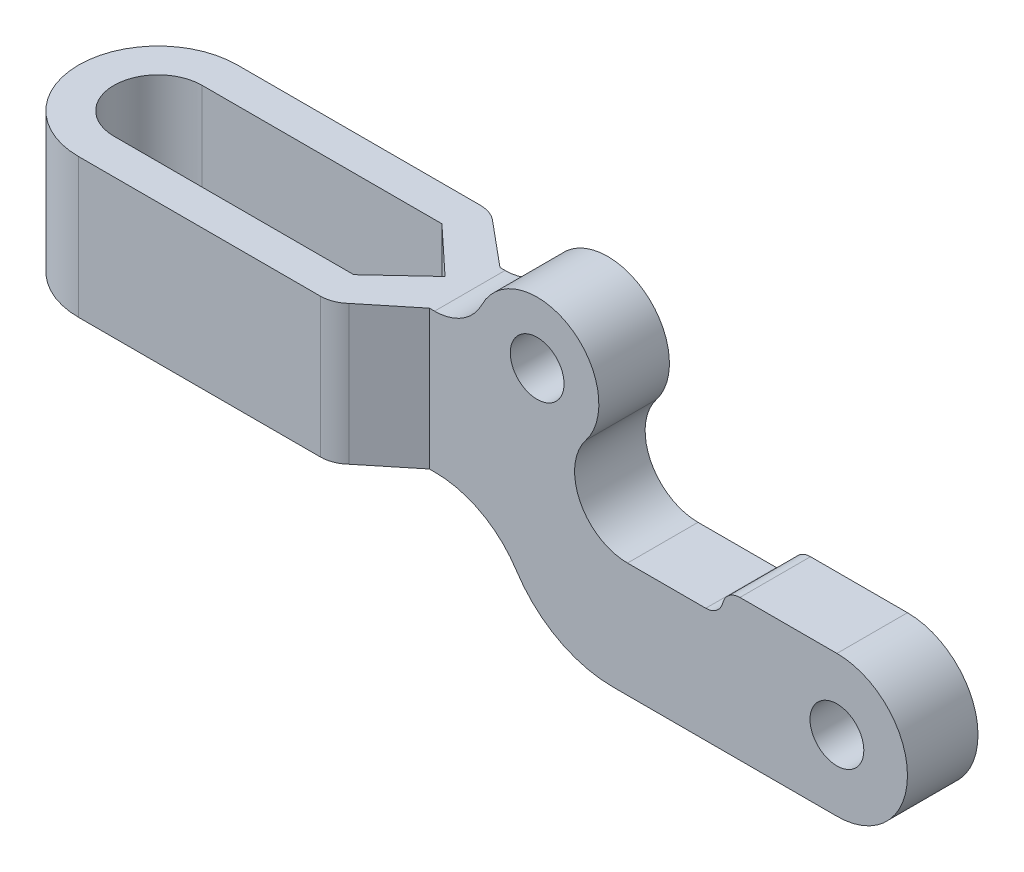
ISO-10303-21;
HEADER;
FILE_DESCRIPTION(('STEP AP214'),'2;1');
FILE_NAME('part.step','',(''),(''),'','','');
FILE_SCHEMA(('AUTOMOTIVE_DESIGN { 1 0 10303 214 1 1 1 1 }'));
ENDSEC;
DATA;
#1=APPLICATION_CONTEXT('core data for automotive mechanical design processes');
#2=APPLICATION_PROTOCOL_DEFINITION('international standard','automotive_design',2000,#1);
#3=PRODUCT_CONTEXT('',#1,'mechanical');
#4=PRODUCT('Part','Part','',(#3));
#5=PRODUCT_RELATED_PRODUCT_CATEGORY('part','',(#4));
#6=PRODUCT_DEFINITION_FORMATION('','',#4);
#7=PRODUCT_DEFINITION_CONTEXT('part definition',#1,'design');
#8=PRODUCT_DEFINITION('design','',#6,#7);
#9=PRODUCT_DEFINITION_SHAPE('','',#8);
#10=(LENGTH_UNIT() NAMED_UNIT(*) SI_UNIT(.MILLI.,.METRE.));
#11=(NAMED_UNIT(*) PLANE_ANGLE_UNIT() SI_UNIT($,.RADIAN.));
#12=(NAMED_UNIT(*) SI_UNIT($,.STERADIAN.) SOLID_ANGLE_UNIT());
#13=UNCERTAINTY_MEASURE_WITH_UNIT(LENGTH_MEASURE(1.E-05),#10,'distance_accuracy_value','');
#14=(GEOMETRIC_REPRESENTATION_CONTEXT(3) GLOBAL_UNCERTAINTY_ASSIGNED_CONTEXT((#13)) GLOBAL_UNIT_ASSIGNED_CONTEXT((#10,
#11,#12)) REPRESENTATION_CONTEXT('',''));
#15=CARTESIAN_POINT('',(0.,0.,0.));
#16=DIRECTION('',(0.,0.,1.));
#17=DIRECTION('',(1.,0.,0.));
#18=AXIS2_PLACEMENT_3D('',#15,#16,#17);
#19=CARTESIAN_POINT('',(-4.99794774322532,31.6999999999998,0.));
#20=DIRECTION('',(0.,0.,1.));
#21=DIRECTION('',(-1.,0.,0.));
#22=AXIS2_PLACEMENT_3D('',#19,#20,#21);
#23=PLANE('',#22);
#24=CARTESIAN_POINT('',(-25.9979474843078,25.1999999999998,0.));
#25=DIRECTION('',(0.,0.,-1.));
#26=DIRECTION('',(-1.,0.,0.));
#27=AXIS2_PLACEMENT_3D('',#24,#25,#26);
#28=CIRCLE('',#27,1.525);
#29=CARTESIAN_POINT('',(-27.5229474843078,25.1999999999998,0.));
#30=VERTEX_POINT('',#29);
#31=EDGE_CURVE('E245',#30,#30,#28,.F.);
#32=ORIENTED_EDGE('',*,*,#31,.T.);
#33=EDGE_LOOP('',(#32));
#34=FACE_BOUND('',#33,.T.);
#35=DIRECTION('',(0.,-1.,0.));
#36=VECTOR('',#35,1.);
#37=CARTESIAN_POINT('',(-32.1079477432253,31.6999999999998,0.));
#38=LINE('',#37,#36);
#39=CARTESIAN_POINT('',(-32.1079477432253,25.0999999999998,0.));
#40=VERTEX_POINT('',#39);
#41=CARTESIAN_POINT('',(-32.1079477432253,17.1999999999998,0.));
#42=VERTEX_POINT('',#41);
#43=EDGE_CURVE('E276',#40,#42,#38,.T.);
#44=ORIENTED_EDGE('',*,*,#43,.F.);
#45=DIRECTION('',(-1.,0.,0.));
#46=VECTOR('',#45,1.);
#47=CARTESIAN_POINT('',(-4.99794774322532,25.0999999999998,0.));
#48=LINE('',#47,#46);
#49=CARTESIAN_POINT('',(-31.8151633132071,25.0999999999998,0.));
#50=VERTEX_POINT('',#49);
#51=EDGE_CURVE('E394',#50,#40,#48,.T.);
#52=ORIENTED_EDGE('',*,*,#51,.F.);
#53=CARTESIAN_POINT('',(-31.8151633132072,28.0999999999998,0.));
#54=DIRECTION('',(0.,0.,-1.));
#55=DIRECTION('',(-1.,0.,0.));
#56=AXIS2_PLACEMENT_3D('',#53,#54,#55);
#57=CIRCLE('',#56,3.00000000000001);
#58=CARTESIAN_POINT('',(-29.1302944690997,26.7615384615382,0.));
#59=VERTEX_POINT('',#58);
#60=EDGE_CURVE('E231',#59,#50,#57,.T.);
#61=ORIENTED_EDGE('',*,*,#60,.F.);
#62=CARTESIAN_POINT('',(-25.9979474843078,25.1999999999998,0.));
#63=DIRECTION('',(0.,0.,-1.));
#64=DIRECTION('',(-1.,0.,0.));
#65=AXIS2_PLACEMENT_3D('',#62,#63,#64);
#66=CIRCLE('',#65,3.49999999999979);
#67=CARTESIAN_POINT('',(-23.2391530473189,23.0461538461538,0.));
#68=VERTEX_POINT('',#67);
#69=EDGE_CURVE('E235',#68,#59,#66,.F.);
#70=ORIENTED_EDGE('',*,*,#69,.F.);
#71=CARTESIAN_POINT('',(-20.8744721013284,21.2,0.));
#72=DIRECTION('',(0.,0.,-1.));
#73=DIRECTION('',(-1.,0.,0.));
#74=AXIS2_PLACEMENT_3D('',#71,#72,#73);
#75=CIRCLE('',#74,2.9999999999999);
#76=CARTESIAN_POINT('',(-20.8744721013284,18.2,0.));
#77=VERTEX_POINT('',#76);
#78=EDGE_CURVE('E407',#77,#68,#75,.T.);
#79=ORIENTED_EDGE('',*,*,#78,.F.);
#80=DIRECTION('',(-1.,0.,0.));
#81=VECTOR('',#80,1.);
#82=CARTESIAN_POINT('',(-4.99794774322541,18.1999999999998,0.));
#83=LINE('',#82,#81);
#84=CARTESIAN_POINT('',(-16.4344721013284,18.1999999999999,0.));
#85=VERTEX_POINT('',#84);
#86=EDGE_CURVE('E409',#85,#77,#83,.T.);
#87=ORIENTED_EDGE('',*,*,#86,.F.);
#88=CARTESIAN_POINT('',(-16.4344721013282,19.1999999999998,0.));
#89=DIRECTION('',(0.,0.,-1.));
#90=DIRECTION('',(-1.,0.,0.));
#91=AXIS2_PLACEMENT_3D('',#88,#89,#90);
#92=CIRCLE('',#91,0.999999999999894);
#93=CARTESIAN_POINT('',(-15.4662303828536,18.9499840512982,0.));
#94=VERTEX_POINT('',#93);
#95=EDGE_CURVE('E412',#94,#85,#92,.T.);
#96=ORIENTED_EDGE('',*,*,#95,.F.);
#97=CARTESIAN_POINT('',(-14.4979474843078,18.6999574692244,0.));
#98=DIRECTION('',(0.,0.,-1.));
#99=DIRECTION('',(-1.,0.,0.));
#100=AXIS2_PLACEMENT_3D('',#97,#98,#99);
#101=CIRCLE('',#100,1.00004253077543);
#102=CARTESIAN_POINT('',(-14.4979474843078,19.6999999999999,0.));
#103=VERTEX_POINT('',#102);
#104=EDGE_CURVE('E238',#103,#94,#101,.F.);
#105=ORIENTED_EDGE('',*,*,#104,.F.);
#106=DIRECTION('',(-1.,0.,0.));
#107=VECTOR('',#106,1.);
#108=CARTESIAN_POINT('',(-4.99794774322552,19.6999999999998,0.));
#109=LINE('',#108,#107);
#110=CARTESIAN_POINT('',(-8.99794748430775,19.6999999999998,0.));
#111=VERTEX_POINT('',#110);
#112=EDGE_CURVE('E232',#111,#103,#109,.T.);
#113=ORIENTED_EDGE('',*,*,#112,.F.);
#114=CARTESIAN_POINT('',(-8.99794748430775,15.6999999999998,0.));
#115=DIRECTION('',(0.,0.,-1.));
#116=DIRECTION('',(-1.,0.,0.));
#117=AXIS2_PLACEMENT_3D('',#114,#115,#116);
#118=CIRCLE('',#117,4.);
#119=CARTESIAN_POINT('',(-8.99794748430775,11.6999999999998,0.));
#120=VERTEX_POINT('',#119);
#121=EDGE_CURVE('E400',#120,#111,#118,.F.);
#122=ORIENTED_EDGE('',*,*,#121,.F.);
#123=DIRECTION('',(1.,0.,0.));
#124=VECTOR('',#123,1.);
#125=CARTESIAN_POINT('',(-4.99794774322532,11.6999999999998,0.));
#126=LINE('',#125,#124);
#127=CARTESIAN_POINT('',(-21.7079474843077,11.6999999999998,0.));
#128=VERTEX_POINT('',#127);
#129=EDGE_CURVE('E263',#128,#120,#126,.T.);
#130=ORIENTED_EDGE('',*,*,#129,.F.);
#131=CARTESIAN_POINT('',(-21.7079474843078,18.1999999999999,0.));
#132=DIRECTION('',(0.,0.,-1.));
#133=DIRECTION('',(-1.,0.,0.));
#134=AXIS2_PLACEMENT_3D('',#131,#132,#133);
#135=CIRCLE('',#134,6.50000000000009);
#136=CARTESIAN_POINT('',(-27.1718046853144,14.6791670748231,0.));
#137=VERTEX_POINT('',#136);
#138=EDGE_CURVE('E230',#137,#128,#135,.F.);
#139=ORIENTED_EDGE('',*,*,#138,.F.);
#140=CARTESIAN_POINT('',(-31.7950684707815,11.7000007535197,0.));
#141=DIRECTION('',(0.,0.,-1.));
#142=DIRECTION('',(-1.,0.,0.));
#143=AXIS2_PLACEMENT_3D('',#140,#141,#142);
#144=CIRCLE('',#143,5.5);
#145=CARTESIAN_POINT('',(-31.7979474843078,17.1999999999998,0.));
#146=VERTEX_POINT('',#145);
#147=EDGE_CURVE('E207',#146,#137,#144,.T.);
#148=ORIENTED_EDGE('',*,*,#147,.F.);
#149=DIRECTION('',(1.,0.,0.));
#150=VECTOR('',#149,1.);
#151=CARTESIAN_POINT('',(-4.99794774322532,17.1999999999998,0.));
#152=LINE('',#151,#150);
#153=EDGE_CURVE('E217',#42,#146,#152,.T.);
#154=ORIENTED_EDGE('',*,*,#153,.F.);
#155=EDGE_LOOP('',(#44,#52,#61,#70,#79,#87,#96,#105,#113,#122,#130,#139,#148,#154));
#156=FACE_BOUND('',#155,.T.);
#157=CARTESIAN_POINT('',(-8.99794748430775,15.6999999999998,0.));
#158=DIRECTION('',(0.,0.,-1.));
#159=DIRECTION('',(-1.,0.,0.));
#160=AXIS2_PLACEMENT_3D('',#157,#158,#159);
#161=CIRCLE('',#160,1.525);
#162=CARTESIAN_POINT('',(-10.5229474843077,15.6999999999998,0.));
#163=VERTEX_POINT('',#162);
#164=EDGE_CURVE('E729',#163,#163,#161,.F.);
#165=ORIENTED_EDGE('',*,*,#164,.T.);
#166=EDGE_LOOP('',(#165));
#167=FACE_BOUND('',#166,.T.);
#168=ADVANCED_FACE('F37',(#34,#156,#167),#23,.F.);
#169=CARTESIAN_POINT('',(-4.99794774322533,31.6999999999998,4.));
#170=DIRECTION('',(0.,0.,-1.));
#171=DIRECTION('',(1.,0.,0.));
#172=AXIS2_PLACEMENT_3D('',#169,#170,#171);
#173=PLANE('',#172);
#174=CARTESIAN_POINT('',(-25.9979474843078,25.1999999999998,3.99999999999998));
#175=DIRECTION('',(0.,0.,1.));
#176=DIRECTION('',(1.,0.,0.));
#177=AXIS2_PLACEMENT_3D('',#174,#175,#176);
#178=CIRCLE('',#177,1.525);
#179=CARTESIAN_POINT('',(-24.4729474843078,25.1999999999998,3.99999999999998));
#180=VERTEX_POINT('',#179);
#181=EDGE_CURVE('E244',#180,#180,#178,.F.);
#182=ORIENTED_EDGE('',*,*,#181,.T.);
#183=EDGE_LOOP('',(#182));
#184=FACE_BOUND('',#183,.T.);
#185=CARTESIAN_POINT('',(-31.7950684707815,11.7000007535197,3.99999999999997));
#186=DIRECTION('',(0.,0.,1.));
#187=DIRECTION('',(1.,0.,0.));
#188=AXIS2_PLACEMENT_3D('',#185,#186,#187);
#189=CIRCLE('',#188,5.5);
#190=CARTESIAN_POINT('',(-27.1718046853144,14.6791670748231,3.99999999999998));
#191=VERTEX_POINT('',#190);
#192=CARTESIAN_POINT('',(-31.7979474843078,17.1999999999998,3.99999999999997));
#193=VERTEX_POINT('',#192);
#194=EDGE_CURVE('E11',#191,#193,#189,.T.);
#195=ORIENTED_EDGE('',*,*,#194,.F.);
#196=CARTESIAN_POINT('',(-21.7079474843077,18.1999999999999,3.99999999999998));
#197=DIRECTION('',(0.,0.,1.));
#198=DIRECTION('',(1.,0.,0.));
#199=AXIS2_PLACEMENT_3D('',#196,#197,#198);
#200=CIRCLE('',#199,6.50000000000009);
#201=CARTESIAN_POINT('',(-21.7079474843078,11.6999999999998,3.99999999999998));
#202=VERTEX_POINT('',#201);
#203=EDGE_CURVE('E403',#202,#191,#200,.F.);
#204=ORIENTED_EDGE('',*,*,#203,.F.);
#205=DIRECTION('',(-1.,0.,0.));
#206=VECTOR('',#205,1.);
#207=CARTESIAN_POINT('',(-4.99794774322533,11.6999999999998,4.));
#208=LINE('',#207,#206);
#209=CARTESIAN_POINT('',(-8.99794748430776,11.6999999999998,4.));
#210=VERTEX_POINT('',#209);
#211=EDGE_CURVE('E266',#210,#202,#208,.T.);
#212=ORIENTED_EDGE('',*,*,#211,.F.);
#213=CARTESIAN_POINT('',(-8.99794748430776,15.6999999999998,4.));
#214=DIRECTION('',(0.,0.,1.));
#215=DIRECTION('',(1.,0.,0.));
#216=AXIS2_PLACEMENT_3D('',#213,#214,#215);
#217=CIRCLE('',#216,4.);
#218=CARTESIAN_POINT('',(-8.99794748430776,19.6999999999998,4.));
#219=VERTEX_POINT('',#218);
#220=EDGE_CURVE('E397',#219,#210,#217,.F.);
#221=ORIENTED_EDGE('',*,*,#220,.F.);
#222=DIRECTION('',(1.,0.,0.));
#223=VECTOR('',#222,1.);
#224=CARTESIAN_POINT('',(-4.99794774322552,19.6999999999998,4.));
#225=LINE('',#224,#223);
#226=CARTESIAN_POINT('',(-14.4979474843079,19.6999999999999,3.99999999999999));
#227=VERTEX_POINT('',#226);
#228=EDGE_CURVE('E306',#227,#219,#225,.T.);
#229=ORIENTED_EDGE('',*,*,#228,.F.);
#230=CARTESIAN_POINT('',(-14.4979474843079,18.6999574692244,3.99999999999999));
#231=DIRECTION('',(0.,0.,1.));
#232=DIRECTION('',(1.,0.,0.));
#233=AXIS2_PLACEMENT_3D('',#230,#231,#232);
#234=CIRCLE('',#233,1.00004253077543);
#235=CARTESIAN_POINT('',(-15.4662303828536,18.9499840512982,3.99999999999999));
#236=VERTEX_POINT('',#235);
#237=EDGE_CURVE('E303',#236,#227,#234,.F.);
#238=ORIENTED_EDGE('',*,*,#237,.F.);
#239=CARTESIAN_POINT('',(-16.4344721013282,19.1999999999998,3.99999999999999));
#240=DIRECTION('',(0.,0.,1.));
#241=DIRECTION('',(1.,0.,0.));
#242=AXIS2_PLACEMENT_3D('',#239,#240,#241);
#243=CIRCLE('',#242,0.999999999999894);
#244=CARTESIAN_POINT('',(-16.4344721013284,18.1999999999999,3.99999999999999));
#245=VERTEX_POINT('',#244);
#246=EDGE_CURVE('E300',#245,#236,#243,.T.);
#247=ORIENTED_EDGE('',*,*,#246,.F.);
#248=DIRECTION('',(1.,0.,0.));
#249=VECTOR('',#248,1.);
#250=CARTESIAN_POINT('',(-4.99794774322542,18.1999999999998,4.));
#251=LINE('',#250,#249);
#252=CARTESIAN_POINT('',(-20.8744721013284,18.2,3.99999999999998));
#253=VERTEX_POINT('',#252);
#254=EDGE_CURVE('E297',#253,#245,#251,.T.);
#255=ORIENTED_EDGE('',*,*,#254,.F.);
#256=CARTESIAN_POINT('',(-20.8744721013284,21.2,3.99999999999998));
#257=DIRECTION('',(0.,0.,1.));
#258=DIRECTION('',(1.,0.,0.));
#259=AXIS2_PLACEMENT_3D('',#256,#257,#258);
#260=CIRCLE('',#259,2.9999999999999);
#261=CARTESIAN_POINT('',(-23.2391530473189,23.0461538461538,3.99999999999998));
#262=VERTEX_POINT('',#261);
#263=EDGE_CURVE('E294',#262,#253,#260,.T.);
#264=ORIENTED_EDGE('',*,*,#263,.F.);
#265=CARTESIAN_POINT('',(-25.9979474843078,25.1999999999998,3.99999999999998));
#266=DIRECTION('',(0.,0.,1.));
#267=DIRECTION('',(1.,0.,0.));
#268=AXIS2_PLACEMENT_3D('',#265,#266,#267);
#269=CIRCLE('',#268,3.49999999999979);
#270=CARTESIAN_POINT('',(-29.1302944690997,26.7615384615382,3.99999999999998));
#271=VERTEX_POINT('',#270);
#272=EDGE_CURVE('E309',#271,#262,#269,.F.);
#273=ORIENTED_EDGE('',*,*,#272,.F.);
#274=CARTESIAN_POINT('',(-31.8151633132071,28.0999999999998,3.99999999999997));
#275=DIRECTION('',(0.,0.,1.));
#276=DIRECTION('',(1.,0.,0.));
#277=AXIS2_PLACEMENT_3D('',#274,#275,#276);
#278=CIRCLE('',#277,3.00000000000001);
#279=CARTESIAN_POINT('',(-31.8151633132072,25.0999999999998,3.99999999999997));
#280=VERTEX_POINT('',#279);
#281=EDGE_CURVE('E46',#280,#271,#278,.T.);
#282=ORIENTED_EDGE('',*,*,#281,.F.);
#283=DIRECTION('',(1.,0.,0.));
#284=VECTOR('',#283,1.);
#285=CARTESIAN_POINT('',(-4.99794774322532,25.0999999999998,4.));
#286=LINE('',#285,#284);
#287=CARTESIAN_POINT('',(-32.1104655495291,25.0999999999998,3.99999999999997));
#288=VERTEX_POINT('',#287);
#289=EDGE_CURVE('E380',#288,#280,#286,.T.);
#290=ORIENTED_EDGE('',*,*,#289,.F.);
#291=DIRECTION('',(0.,-1.,0.));
#292=VECTOR('',#291,1.);
#293=CARTESIAN_POINT('',(-32.1104655495291,31.6999999999998,3.99999999999997));
#294=LINE('',#293,#292);
#295=CARTESIAN_POINT('',(-32.1104655495291,17.1999999999998,3.99999999999997));
#296=VERTEX_POINT('',#295);
#297=EDGE_CURVE('E273',#288,#296,#294,.T.);
#298=ORIENTED_EDGE('',*,*,#297,.T.);
#299=DIRECTION('',(-1.,0.,0.));
#300=VECTOR('',#299,1.);
#301=CARTESIAN_POINT('',(-4.99794774322533,17.1999999999998,4.));
#302=LINE('',#301,#300);
#303=EDGE_CURVE('E354',#193,#296,#302,.T.);
#304=ORIENTED_EDGE('',*,*,#303,.F.);
#305=EDGE_LOOP('',(#195,#204,#212,#221,#229,#238,#247,#255,#264,#273,#282,#290,#298,#304));
#306=FACE_BOUND('',#305,.T.);
#307=CARTESIAN_POINT('',(-8.99794748430776,15.6999999999998,4.));
#308=DIRECTION('',(0.,0.,1.));
#309=DIRECTION('',(1.,0.,0.));
#310=AXIS2_PLACEMENT_3D('',#307,#308,#309);
#311=CIRCLE('',#310,1.525);
#312=CARTESIAN_POINT('',(-7.47294748430776,15.6999999999998,4.));
#313=VERTEX_POINT('',#312);
#314=EDGE_CURVE('E41',#313,#313,#311,.F.);
#315=ORIENTED_EDGE('',*,*,#314,.T.);
#316=EDGE_LOOP('',(#315));
#317=FACE_BOUND('',#316,.T.);
#318=ADVANCED_FACE('F322',(#184,#306,#317),#173,.F.);
#319=CARTESIAN_POINT('',(-49.4979477432251,31.6999999999998,4.49999999999995));
#320=DIRECTION('',(0.,0.,-1.));
#321=DIRECTION('',(1.,0.,0.));
#322=AXIS2_PLACEMENT_3D('',#319,#320,#321);
#323=PLANE('',#322);
#324=DIRECTION('',(1.,0.,0.));
#325=VECTOR('',#324,1.);
#326=CARTESIAN_POINT('',(-49.4979477432251,25.0999999999998,4.49999999999995));
#327=LINE('',#326,#325);
#328=CARTESIAN_POINT('',(-49.4979477432251,25.0999999999998,4.49999999999995));
#329=VERTEX_POINT('',#328);
#330=CARTESIAN_POINT('',(-35.8987919107693,25.0999999999998,4.49999999999996));
#331=VERTEX_POINT('',#330);
#332=EDGE_CURVE('E289',#329,#331,#327,.T.);
#333=ORIENTED_EDGE('',*,*,#332,.T.);
#334=DIRECTION('',(0.,-1.,0.));
#335=VECTOR('',#334,1.);
#336=CARTESIAN_POINT('',(-35.8987919107693,31.6999999999998,4.49999999999997));
#337=LINE('',#336,#335);
#338=CARTESIAN_POINT('',(-35.8987919107693,17.1999999999998,4.49999999999997));
#339=VERTEX_POINT('',#338);
#340=EDGE_CURVE('E251',#331,#339,#337,.T.);
#341=ORIENTED_EDGE('',*,*,#340,.T.);
#342=DIRECTION('',(-1.,0.,0.));
#343=VECTOR('',#342,1.);
#344=CARTESIAN_POINT('',(-49.4979477432251,17.1999999999998,4.49999999999995));
#345=LINE('',#344,#343);
#346=CARTESIAN_POINT('',(-49.4979477432251,17.1999999999998,4.49999999999995));
#347=VERTEX_POINT('',#346);
#348=EDGE_CURVE('E284',#339,#347,#345,.T.);
#349=ORIENTED_EDGE('',*,*,#348,.T.);
#350=DIRECTION('',(0.,-1.,0.));
#351=VECTOR('',#350,1.);
#352=CARTESIAN_POINT('',(-49.4979477432251,31.6999999999998,4.49999999999995));
#353=LINE('',#352,#351);
#354=EDGE_CURVE('E248',#329,#347,#353,.T.);
#355=ORIENTED_EDGE('',*,*,#354,.F.);
#356=EDGE_LOOP('',(#333,#341,#349,#355));
#357=FACE_BOUND('',#356,.T.);
#358=ADVANCED_FACE('F490',(#357),#323,.T.);
#359=CARTESIAN_POINT('',(-33.220220482198,31.6999999999998,1.99999999999997));
#360=DIRECTION('',(-0.682318250360036,0.,-0.731055268242846));
#361=DIRECTION('',(0.731055268242847,0.,-0.682318250360036));
#362=AXIS2_PLACEMENT_3D('',#359,#360,#361);
#363=PLANE('',#362);
#364=DIRECTION('',(0.731055268242847,0.,-0.682318250360036));
#365=VECTOR('',#364,1.);
#366=CARTESIAN_POINT('',(-33.220220482198,25.0999999999998,1.99999999999997));
#367=LINE('',#366,#365);
#368=CARTESIAN_POINT('',(-33.220220482198,25.0999999999998,1.99999999999997));
#369=VERTEX_POINT('',#368);
#370=EDGE_CURVE('E225',#331,#369,#367,.T.);
#371=ORIENTED_EDGE('',*,*,#370,.T.);
#372=DIRECTION('',(0.,-1.,0.));
#373=VECTOR('',#372,1.);
#374=CARTESIAN_POINT('',(-33.220220482198,31.6999999999998,1.99999999999997));
#375=LINE('',#374,#373);
#376=CARTESIAN_POINT('',(-33.2202204821981,17.1999999999998,1.99999999999996));
#377=VERTEX_POINT('',#376);
#378=EDGE_CURVE('E254',#369,#377,#375,.T.);
#379=ORIENTED_EDGE('',*,*,#378,.T.);
#380=DIRECTION('',(-0.731055268242847,0.,0.682318250360036));
#381=VECTOR('',#380,1.);
#382=CARTESIAN_POINT('',(-33.2202204821981,17.1999999999998,1.99999999999997));
#383=LINE('',#382,#381);
#384=EDGE_CURVE('E331',#377,#339,#383,.T.);
#385=ORIENTED_EDGE('',*,*,#384,.T.);
#386=ORIENTED_EDGE('',*,*,#340,.F.);
#387=EDGE_LOOP('',(#371,#379,#385,#386));
#388=FACE_BOUND('',#387,.T.);
#389=ADVANCED_FACE('F606',(#388),#363,.T.);
#390=CARTESIAN_POINT('',(-33.220220482198,31.6999999999998,1.99999999999997));
#391=DIRECTION('',(-0.682318250360009,0.,0.731055268242871));
#392=DIRECTION('',(-0.731055268242871,0.,-0.682318250360009));
#393=AXIS2_PLACEMENT_3D('',#390,#391,#392);
#394=PLANE('',#393);
#395=DIRECTION('',(-0.731055268242871,0.,-0.682318250360009));
#396=VECTOR('',#395,1.);
#397=CARTESIAN_POINT('',(-33.220220482198,25.0999999999998,1.99999999999997));
#398=LINE('',#397,#396);
#399=CARTESIAN_POINT('',(-35.8987919107695,25.0999999999998,-0.500000000000036));
#400=VERTEX_POINT('',#399);
#401=EDGE_CURVE('E364',#369,#400,#398,.T.);
#402=ORIENTED_EDGE('',*,*,#401,.T.);
#403=DIRECTION('',(0.,-1.,0.));
#404=VECTOR('',#403,1.);
#405=CARTESIAN_POINT('',(-35.8987919107695,31.6999999999998,-0.500000000000035));
#406=LINE('',#405,#404);
#407=CARTESIAN_POINT('',(-35.8987919107695,17.1999999999998,-0.500000000000036));
#408=VERTEX_POINT('',#407);
#409=EDGE_CURVE('E257',#400,#408,#406,.T.);
#410=ORIENTED_EDGE('',*,*,#409,.T.);
#411=DIRECTION('',(0.731055268242871,0.,0.682318250360009));
#412=VECTOR('',#411,1.);
#413=CARTESIAN_POINT('',(-33.2202204821981,17.1999999999998,1.99999999999997));
#414=LINE('',#413,#412);
#415=EDGE_CURVE('E333',#408,#377,#414,.T.);
#416=ORIENTED_EDGE('',*,*,#415,.T.);
#417=ORIENTED_EDGE('',*,*,#378,.F.);
#418=EDGE_LOOP('',(#402,#410,#416,#417));
#419=FACE_BOUND('',#418,.T.);
#420=ADVANCED_FACE('F597',(#419),#394,.T.);
#421=CARTESIAN_POINT('',(-49.4979477432251,31.6999999999998,-0.500000000000052));
#422=DIRECTION('',(0.,0.,1.));
#423=DIRECTION('',(-1.,0.,0.));
#424=AXIS2_PLACEMENT_3D('',#421,#422,#423);
#425=PLANE('',#424);
#426=DIRECTION('',(-1.,0.,0.));
#427=VECTOR('',#426,1.);
#428=CARTESIAN_POINT('',(-49.4979477432251,25.0999999999998,-0.500000000000052));
#429=LINE('',#428,#427);
#430=CARTESIAN_POINT('',(-49.4979477432251,25.0999999999998,-0.500000000000052));
#431=VERTEX_POINT('',#430);
#432=EDGE_CURVE('E367',#400,#431,#429,.T.);
#433=ORIENTED_EDGE('',*,*,#432,.T.);
#434=DIRECTION('',(0.,-1.,0.));
#435=VECTOR('',#434,1.);
#436=CARTESIAN_POINT('',(-49.4979477432251,31.6999999999998,-0.500000000000052));
#437=LINE('',#436,#435);
#438=CARTESIAN_POINT('',(-49.4979477432251,17.1999999999998,-0.500000000000052));
#439=VERTEX_POINT('',#438);
#440=EDGE_CURVE('E260',#431,#439,#437,.T.);
#441=ORIENTED_EDGE('',*,*,#440,.T.);
#442=DIRECTION('',(1.,0.,0.));
#443=VECTOR('',#442,1.);
#444=CARTESIAN_POINT('',(-49.4979477432251,17.1999999999998,-0.500000000000052));
#445=LINE('',#444,#443);
#446=EDGE_CURVE('E338',#439,#408,#445,.T.);
#447=ORIENTED_EDGE('',*,*,#446,.T.);
#448=ORIENTED_EDGE('',*,*,#409,.F.);
#449=EDGE_LOOP('',(#433,#441,#447,#448));
#450=FACE_BOUND('',#449,.T.);
#451=ADVANCED_FACE('F588',(#450),#425,.T.);
#452=CARTESIAN_POINT('',(-49.4979477432251,31.6999999999998,1.99999999999995));
#453=DIRECTION('',(0.,-1.,0.));
#454=DIRECTION('',(-1.,0.,0.));
#455=AXIS2_PLACEMENT_3D('',#452,#453,#454);
#456=CYLINDRICAL_SURFACE('',#455,2.5);
#457=CARTESIAN_POINT('',(-49.4979477432251,25.0999999999998,1.99999999999995));
#458=DIRECTION('',(0.,1.,0.));
#459=DIRECTION('',(-1.,0.,0.));
#460=AXIS2_PLACEMENT_3D('',#457,#458,#459);
#461=CIRCLE('',#460,2.5);
#462=EDGE_CURVE('E370',#431,#329,#461,.T.);
#463=ORIENTED_EDGE('',*,*,#462,.T.);
#464=ORIENTED_EDGE('',*,*,#354,.T.);
#465=CARTESIAN_POINT('',(-49.4979477432251,17.1999999999998,1.99999999999995));
#466=DIRECTION('',(0.,-1.,0.));
#467=DIRECTION('',(1.,0.,0.));
#468=AXIS2_PLACEMENT_3D('',#465,#466,#467);
#469=CIRCLE('',#468,2.5);
#470=EDGE_CURVE('E340',#347,#439,#469,.T.);
#471=ORIENTED_EDGE('',*,*,#470,.T.);
#472=ORIENTED_EDGE('',*,*,#440,.F.);
#473=EDGE_LOOP('',(#463,#464,#471,#472));
#474=FACE_BOUND('',#473,.T.);
#475=ADVANCED_FACE('F580',(#474),#456,.F.);
#476=CARTESIAN_POINT('',(-21.7079474843077,18.1999999999999,-22.5));
#477=DIRECTION('',(0.,0.,1.));
#478=DIRECTION('',(-1.,0.,0.));
#479=AXIS2_PLACEMENT_3D('',#476,#477,#478);
#480=CYLINDRICAL_SURFACE('',#479,6.50000000000009);
#481=DIRECTION('',(0.,0.,1.));
#482=VECTOR('',#481,1.);
#483=CARTESIAN_POINT('',(-27.1718046853144,14.6791670748231,-22.5));
#484=LINE('',#483,#482);
#485=EDGE_CURVE('E214',#137,#191,#484,.T.);
#486=ORIENTED_EDGE('',*,*,#485,.F.);
#487=ORIENTED_EDGE('',*,*,#138,.T.);
#488=DIRECTION('',(0.,0.,1.));
#489=VECTOR('',#488,1.);
#490=CARTESIAN_POINT('',(-21.7079474843077,11.6999999999998,-22.5));
#491=LINE('',#490,#489);
#492=EDGE_CURVE('E292',#202,#128,#491,.F.);
#493=ORIENTED_EDGE('',*,*,#492,.F.);
#494=ORIENTED_EDGE('',*,*,#203,.T.);
#495=EDGE_LOOP('',(#486,#487,#493,#494));
#496=FACE_BOUND('',#495,.T.);
#497=ADVANCED_FACE('F441',(#496),#480,.T.);
#498=CARTESIAN_POINT('',(-31.7979474843078,17.1999999999998,-22.5));
#499=DIRECTION('',(0.,1.,0.));
#500=DIRECTION('',(1.,0.,0.));
#501=AXIS2_PLACEMENT_3D('',#498,#499,#500);
#502=PLANE('',#501);
#503=ORIENTED_EDGE('',*,*,#470,.F.);
#504=ORIENTED_EDGE('',*,*,#348,.F.);
#505=ORIENTED_EDGE('',*,*,#384,.F.);
#506=ORIENTED_EDGE('',*,*,#415,.F.);
#507=ORIENTED_EDGE('',*,*,#446,.F.);
#508=EDGE_LOOP('',(#503,#504,#505,#506,#507));
#509=FACE_BOUND('',#508,.T.);
#510=DIRECTION('',(0.768221279597351,0.,0.64018439966451));
#511=VECTOR('',#510,1.);
#512=CARTESIAN_POINT('',(-32.1079477432253,17.1999999999998,0.));
#513=LINE('',#512,#511);
#514=CARTESIAN_POINT('',(-34.5931800201484,17.1999999999998,-2.07102689743611));
#515=VERTEX_POINT('',#514);
#516=EDGE_CURVE('E221',#515,#42,#513,.T.);
#517=ORIENTED_EDGE('',*,*,#516,.T.);
#518=ORIENTED_EDGE('',*,*,#153,.T.);
#519=DIRECTION('',(0.,0.,1.));
#520=VECTOR('',#519,1.);
#521=CARTESIAN_POINT('',(-31.7979474843078,17.1999999999998,-22.5));
#522=LINE('',#521,#520);
#523=EDGE_CURVE('E203',#146,#193,#522,.T.);
#524=ORIENTED_EDGE('',*,*,#523,.T.);
#525=ORIENTED_EDGE('',*,*,#303,.T.);
#526=DIRECTION('',(-0.775613482818629,0.,0.631208147341237));
#527=VECTOR('',#526,1.);
#528=CARTESIAN_POINT('',(-32.1104655495291,17.1999999999998,3.99999999999997));
#529=LINE('',#528,#527);
#530=CARTESIAN_POINT('',(-34.6206019309714,17.1999999999998,6.04279395601293));
#531=VERTEX_POINT('',#530);
#532=EDGE_CURVE('E348',#296,#531,#529,.T.);
#533=ORIENTED_EDGE('',*,*,#532,.T.);
#534=CARTESIAN_POINT('',(-35.7805429565833,17.1999999999998,4.79999999999996));
#535=DIRECTION('',(0.,-1.,0.));
#536=DIRECTION('',(1.,0.,0.));
#537=AXIS2_PLACEMENT_3D('',#534,#535,#536);
#538=CIRCLE('',#537,1.7);
#539=CARTESIAN_POINT('',(-35.7805429565834,17.1999999999998,6.49999999999996));
#540=VERTEX_POINT('',#539);
#541=EDGE_CURVE('E345',#531,#540,#538,.T.);
#542=ORIENTED_EDGE('',*,*,#541,.T.);
#543=DIRECTION('',(-1.,0.,0.));
#544=VECTOR('',#543,1.);
#545=CARTESIAN_POINT('',(-49.4979477432251,17.1999999999998,6.49999999999995));
#546=LINE('',#545,#544);
#547=CARTESIAN_POINT('',(-49.4979477432251,17.1999999999998,6.49999999999995));
#548=VERTEX_POINT('',#547);
#549=EDGE_CURVE('E342',#540,#548,#546,.T.);
#550=ORIENTED_EDGE('',*,*,#549,.T.);
#551=CARTESIAN_POINT('',(-49.4979477432251,17.1999999999998,1.99999999999995));
#552=DIRECTION('',(0.,-1.,0.));
#553=DIRECTION('',(1.,0.,0.));
#554=AXIS2_PLACEMENT_3D('',#551,#552,#553);
#555=CIRCLE('',#554,4.5);
#556=CARTESIAN_POINT('',(-49.4979477432251,17.1999999999998,-2.50000000000005));
#557=VERTEX_POINT('',#556);
#558=EDGE_CURVE('E351',#548,#557,#555,.T.);
#559=ORIENTED_EDGE('',*,*,#558,.T.);
#560=DIRECTION('',(1.,0.,0.));
#561=VECTOR('',#560,1.);
#562=CARTESIAN_POINT('',(-49.4979477432251,17.1999999999998,-2.50000000000005));
#563=LINE('',#562,#561);
#564=CARTESIAN_POINT('',(-35.7805429565833,17.1999999999998,-2.50000000000003));
#565=VERTEX_POINT('',#564);
#566=EDGE_CURVE('E356',#557,#565,#563,.T.);
#567=ORIENTED_EDGE('',*,*,#566,.T.);
#568=CARTESIAN_POINT('',(-35.7232015820098,17.1999999999998,-0.800967343821223));
#569=DIRECTION('',(0.,-1.,0.));
#570=DIRECTION('',(1.,0.,0.));
#571=AXIS2_PLACEMENT_3D('',#568,#569,#570);
#572=CIRCLE('',#571,1.7);
#573=EDGE_CURVE('E359',#565,#515,#572,.T.);
#574=ORIENTED_EDGE('',*,*,#573,.T.);
#575=EDGE_LOOP('',(#517,#518,#524,#525,#533,#542,#550,#559,#567,#574));
#576=FACE_BOUND('',#575,.T.);
#577=ADVANCED_FACE('F218',(#509,#576),#502,.F.);
#578=CARTESIAN_POINT('',(-31.7950684707815,11.7000007535197,-22.5));
#579=DIRECTION('',(0.,0.,1.));
#580=DIRECTION('',(-1.,0.,0.));
#581=AXIS2_PLACEMENT_3D('',#578,#579,#580);
#582=CYLINDRICAL_SURFACE('',#581,5.5);
#583=ORIENTED_EDGE('',*,*,#523,.F.);
#584=ORIENTED_EDGE('',*,*,#147,.T.);
#585=ORIENTED_EDGE('',*,*,#485,.T.);
#586=ORIENTED_EDGE('',*,*,#194,.T.);
#587=EDGE_LOOP('',(#583,#584,#585,#586));
#588=FACE_BOUND('',#587,.T.);
#589=ADVANCED_FACE('F205',(#588),#582,.F.);
#590=CARTESIAN_POINT('',(-25.9979474843077,25.1999999999998,-22.5));
#591=DIRECTION('',(0.,0.,1.));
#592=DIRECTION('',(-1.,0.,0.));
#593=AXIS2_PLACEMENT_3D('',#590,#591,#592);
#594=CYLINDRICAL_SURFACE('',#593,3.49999999999979);
#595=DIRECTION('',(0.,0.,1.));
#596=VECTOR('',#595,1.);
#597=CARTESIAN_POINT('',(-23.2391530473189,23.0461538461538,-22.5));
#598=LINE('',#597,#596);
#599=EDGE_CURVE('E327',#68,#262,#598,.T.);
#600=ORIENTED_EDGE('',*,*,#599,.F.);
#601=ORIENTED_EDGE('',*,*,#69,.T.);
#602=DIRECTION('',(0.,0.,1.));
#603=VECTOR('',#602,1.);
#604=CARTESIAN_POINT('',(-29.1302944690996,26.7615384615382,-22.5));
#605=LINE('',#604,#603);
#606=EDGE_CURVE('E317',#59,#271,#605,.T.);
#607=ORIENTED_EDGE('',*,*,#606,.T.);
#608=ORIENTED_EDGE('',*,*,#272,.T.);
#609=EDGE_LOOP('',(#600,#601,#607,#608));
#610=FACE_BOUND('',#609,.T.);
#611=ADVANCED_FACE('F326',(#610),#594,.T.);
#612=CARTESIAN_POINT('',(-31.8151633132071,28.0999999999998,-22.5));
#613=DIRECTION('',(0.,0.,1.));
#614=DIRECTION('',(-1.,0.,0.));
#615=AXIS2_PLACEMENT_3D('',#612,#613,#614);
#616=CYLINDRICAL_SURFACE('',#615,3.00000000000001);
#617=ORIENTED_EDGE('',*,*,#606,.F.);
#618=ORIENTED_EDGE('',*,*,#60,.T.);
#619=DIRECTION('',(0.,0.,1.));
#620=VECTOR('',#619,1.);
#621=CARTESIAN_POINT('',(-31.8151633132071,25.0999999999998,-22.5));
#622=LINE('',#621,#620);
#623=EDGE_CURVE('E213',#50,#280,#622,.T.);
#624=ORIENTED_EDGE('',*,*,#623,.T.);
#625=ORIENTED_EDGE('',*,*,#281,.T.);
#626=EDGE_LOOP('',(#617,#618,#624,#625));
#627=FACE_BOUND('',#626,.T.);
#628=ADVANCED_FACE('F316',(#627),#616,.F.);
#629=CARTESIAN_POINT('',(-8.99794748430772,19.6999999999998,-22.5));
#630=DIRECTION('',(0.,-1.,0.));
#631=DIRECTION('',(-1.,0.,0.));
#632=AXIS2_PLACEMENT_3D('',#629,#630,#631);
#633=PLANE('',#632);
#634=DIRECTION('',(0.,0.,1.));
#635=VECTOR('',#634,1.);
#636=CARTESIAN_POINT('',(-8.99794748430772,19.6999999999998,-22.5));
#637=LINE('',#636,#635);
#638=EDGE_CURVE('E430',#111,#219,#637,.T.);
#639=ORIENTED_EDGE('',*,*,#638,.F.);
#640=ORIENTED_EDGE('',*,*,#112,.T.);
#641=DIRECTION('',(0.,0.,1.));
#642=VECTOR('',#641,1.);
#643=CARTESIAN_POINT('',(-14.4979474843078,19.6999999999999,-22.5));
#644=LINE('',#643,#642);
#645=EDGE_CURVE('E420',#103,#227,#644,.T.);
#646=ORIENTED_EDGE('',*,*,#645,.T.);
#647=ORIENTED_EDGE('',*,*,#228,.T.);
#648=EDGE_LOOP('',(#639,#640,#646,#647));
#649=FACE_BOUND('',#648,.T.);
#650=ADVANCED_FACE('F537',(#649),#633,.F.);
#651=CARTESIAN_POINT('',(-14.4979474843078,18.6999574692244,-22.5));
#652=DIRECTION('',(0.,0.,1.));
#653=DIRECTION('',(-1.,0.,0.));
#654=AXIS2_PLACEMENT_3D('',#651,#652,#653);
#655=CYLINDRICAL_SURFACE('',#654,1.00004253077543);
#656=ORIENTED_EDGE('',*,*,#645,.F.);
#657=ORIENTED_EDGE('',*,*,#104,.T.);
#658=DIRECTION('',(0.,0.,1.));
#659=VECTOR('',#658,1.);
#660=CARTESIAN_POINT('',(-15.4662303828536,18.9499840512982,-22.5));
#661=LINE('',#660,#659);
#662=EDGE_CURVE('E419',#94,#236,#661,.T.);
#663=ORIENTED_EDGE('',*,*,#662,.T.);
#664=ORIENTED_EDGE('',*,*,#237,.T.);
#665=EDGE_LOOP('',(#656,#657,#663,#664));
#666=FACE_BOUND('',#665,.T.);
#667=ADVANCED_FACE('F418',(#666),#655,.T.);
#668=CARTESIAN_POINT('',(-16.4344721013281,19.1999999999998,-22.5));
#669=DIRECTION('',(0.,0.,1.));
#670=DIRECTION('',(-1.,0.,0.));
#671=AXIS2_PLACEMENT_3D('',#668,#669,#670);
#672=CYLINDRICAL_SURFACE('',#671,0.999999999999894);
#673=ORIENTED_EDGE('',*,*,#662,.F.);
#674=ORIENTED_EDGE('',*,*,#95,.T.);
#675=DIRECTION('',(0.,0.,1.));
#676=VECTOR('',#675,1.);
#677=CARTESIAN_POINT('',(-16.4344721013283,18.1999999999999,-22.5));
#678=LINE('',#677,#676);
#679=EDGE_CURVE('E426',#85,#245,#678,.T.);
#680=ORIENTED_EDGE('',*,*,#679,.T.);
#681=ORIENTED_EDGE('',*,*,#246,.T.);
#682=EDGE_LOOP('',(#673,#674,#680,#681));
#683=FACE_BOUND('',#682,.T.);
#684=ADVANCED_FACE('F425',(#683),#672,.F.);
#685=CARTESIAN_POINT('',(-16.4344721013283,18.1999999999999,-22.5));
#686=DIRECTION('',(0.,-1.,0.));
#687=DIRECTION('',(-1.,0.,0.));
#688=AXIS2_PLACEMENT_3D('',#685,#686,#687);
#689=PLANE('',#688);
#690=ORIENTED_EDGE('',*,*,#679,.F.);
#691=ORIENTED_EDGE('',*,*,#86,.T.);
#692=DIRECTION('',(0.,0.,1.));
#693=VECTOR('',#692,1.);
#694=CARTESIAN_POINT('',(-20.8744721013283,18.2,-22.5));
#695=LINE('',#694,#693);
#696=EDGE_CURVE('E432',#77,#253,#695,.T.);
#697=ORIENTED_EDGE('',*,*,#696,.T.);
#698=ORIENTED_EDGE('',*,*,#254,.T.);
#699=EDGE_LOOP('',(#690,#691,#697,#698));
#700=FACE_BOUND('',#699,.T.);
#701=ADVANCED_FACE('F513',(#700),#689,.F.);
#702=CARTESIAN_POINT('',(-20.8744721013283,21.2,-22.5));
#703=DIRECTION('',(0.,0.,1.));
#704=DIRECTION('',(-1.,0.,0.));
#705=AXIS2_PLACEMENT_3D('',#702,#703,#704);
#706=CYLINDRICAL_SURFACE('',#705,2.9999999999999);
#707=ORIENTED_EDGE('',*,*,#696,.F.);
#708=ORIENTED_EDGE('',*,*,#78,.T.);
#709=ORIENTED_EDGE('',*,*,#599,.T.);
#710=ORIENTED_EDGE('',*,*,#263,.T.);
#711=EDGE_LOOP('',(#707,#708,#709,#710));
#712=FACE_BOUND('',#711,.T.);
#713=ADVANCED_FACE('F478',(#712),#706,.F.);
#714=CARTESIAN_POINT('',(-8.99794748430772,15.6999999999998,-22.5));
#715=DIRECTION('',(0.,0.,1.));
#716=DIRECTION('',(-1.,0.,0.));
#717=AXIS2_PLACEMENT_3D('',#714,#715,#716);
#718=CYLINDRICAL_SURFACE('',#717,4.);
#719=DIRECTION('',(0.,0.,1.));
#720=VECTOR('',#719,1.);
#721=CARTESIAN_POINT('',(-8.99794748430772,11.6999999999998,-22.5));
#722=LINE('',#721,#720);
#723=EDGE_CURVE('E437',#120,#210,#722,.T.);
#724=ORIENTED_EDGE('',*,*,#723,.F.);
#725=ORIENTED_EDGE('',*,*,#121,.T.);
#726=ORIENTED_EDGE('',*,*,#638,.T.);
#727=ORIENTED_EDGE('',*,*,#220,.T.);
#728=EDGE_LOOP('',(#724,#725,#726,#727));
#729=FACE_BOUND('',#728,.T.);
#730=ADVANCED_FACE('F468',(#729),#718,.T.);
#731=CARTESIAN_POINT('',(-31.8151633132071,25.0999999999998,-22.5));
#732=DIRECTION('',(0.,-1.,0.));
#733=DIRECTION('',(-1.,0.,0.));
#734=AXIS2_PLACEMENT_3D('',#731,#732,#733);
#735=PLANE('',#734);
#736=ORIENTED_EDGE('',*,*,#462,.F.);
#737=ORIENTED_EDGE('',*,*,#432,.F.);
#738=ORIENTED_EDGE('',*,*,#401,.F.);
#739=ORIENTED_EDGE('',*,*,#370,.F.);
#740=ORIENTED_EDGE('',*,*,#332,.F.);
#741=EDGE_LOOP('',(#736,#737,#738,#739,#740));
#742=FACE_BOUND('',#741,.T.);
#743=ORIENTED_EDGE('',*,*,#623,.F.);
#744=ORIENTED_EDGE('',*,*,#51,.T.);
#745=DIRECTION('',(-0.768221279597351,0.,-0.64018439966451));
#746=VECTOR('',#745,1.);
#747=CARTESIAN_POINT('',(-32.1079477432253,25.0999999999998,0.));
#748=LINE('',#747,#746);
#749=CARTESIAN_POINT('',(-34.5931800201484,25.0999999999998,-2.07102689743611));
#750=VERTEX_POINT('',#749);
#751=EDGE_CURVE('E391',#40,#750,#748,.T.);
#752=ORIENTED_EDGE('',*,*,#751,.T.);
#753=CARTESIAN_POINT('',(-35.7232015820098,25.0999999999998,-0.800967343821223));
#754=DIRECTION('',(0.,1.,0.));
#755=DIRECTION('',(-1.,0.,0.));
#756=AXIS2_PLACEMENT_3D('',#753,#754,#755);
#757=CIRCLE('',#756,1.7);
#758=CARTESIAN_POINT('',(-35.7805429565833,25.0999999999998,-2.50000000000003));
#759=VERTEX_POINT('',#758);
#760=EDGE_CURVE('E388',#750,#759,#757,.T.);
#761=ORIENTED_EDGE('',*,*,#760,.T.);
#762=DIRECTION('',(-1.,0.,0.));
#763=VECTOR('',#762,1.);
#764=CARTESIAN_POINT('',(-49.4979477432251,25.0999999999998,-2.50000000000005));
#765=LINE('',#764,#763);
#766=CARTESIAN_POINT('',(-49.4979477432251,25.0999999999998,-2.50000000000005));
#767=VERTEX_POINT('',#766);
#768=EDGE_CURVE('E384',#759,#767,#765,.T.);
#769=ORIENTED_EDGE('',*,*,#768,.T.);
#770=CARTESIAN_POINT('',(-49.4979477432251,25.0999999999998,1.99999999999995));
#771=DIRECTION('',(0.,1.,0.));
#772=DIRECTION('',(-1.,0.,0.));
#773=AXIS2_PLACEMENT_3D('',#770,#771,#772);
#774=CIRCLE('',#773,4.5);
#775=CARTESIAN_POINT('',(-49.4979477432251,25.0999999999998,6.49999999999995));
#776=VERTEX_POINT('',#775);
#777=EDGE_CURVE('E381',#767,#776,#774,.T.);
#778=ORIENTED_EDGE('',*,*,#777,.T.);
#779=DIRECTION('',(1.,0.,0.));
#780=VECTOR('',#779,1.);
#781=CARTESIAN_POINT('',(-49.4979477432251,25.0999999999998,6.49999999999995));
#782=LINE('',#781,#780);
#783=CARTESIAN_POINT('',(-35.7805429565834,25.0999999999998,6.49999999999996));
#784=VERTEX_POINT('',#783);
#785=EDGE_CURVE('E372',#776,#784,#782,.T.);
#786=ORIENTED_EDGE('',*,*,#785,.T.);
#787=CARTESIAN_POINT('',(-35.7805429565833,25.0999999999998,4.79999999999996));
#788=DIRECTION('',(0.,1.,0.));
#789=DIRECTION('',(-1.,0.,0.));
#790=AXIS2_PLACEMENT_3D('',#787,#788,#789);
#791=CIRCLE('',#790,1.7);
#792=CARTESIAN_POINT('',(-34.6206019309714,25.0999999999998,6.04279395601293));
#793=VERTEX_POINT('',#792);
#794=EDGE_CURVE('E375',#784,#793,#791,.T.);
#795=ORIENTED_EDGE('',*,*,#794,.T.);
#796=DIRECTION('',(0.775613482818629,0.,-0.631208147341237));
#797=VECTOR('',#796,1.);
#798=CARTESIAN_POINT('',(-32.1104655495291,25.0999999999998,3.99999999999997));
#799=LINE('',#798,#797);
#800=EDGE_CURVE('E378',#793,#288,#799,.T.);
#801=ORIENTED_EDGE('',*,*,#800,.T.);
#802=ORIENTED_EDGE('',*,*,#289,.T.);
#803=EDGE_LOOP('',(#743,#744,#752,#761,#769,#778,#786,#795,#801,#802));
#804=FACE_BOUND('',#803,.T.);
#805=ADVANCED_FACE('F465',(#742,#804),#735,.F.);
#806=CARTESIAN_POINT('',(-49.4979477432251,11.6999999999998,1.99999999999995));
#807=DIRECTION('',(0.,1.,0.));
#808=DIRECTION('',(1.,0.,0.));
#809=AXIS2_PLACEMENT_3D('',#806,#807,#808);
#810=PLANE('',#809);
#811=ORIENTED_EDGE('',*,*,#492,.T.);
#812=ORIENTED_EDGE('',*,*,#129,.T.);
#813=ORIENTED_EDGE('',*,*,#723,.T.);
#814=ORIENTED_EDGE('',*,*,#211,.T.);
#815=EDGE_LOOP('',(#811,#812,#813,#814));
#816=FACE_BOUND('',#815,.T.);
#817=ADVANCED_FACE('F467',(#816),#810,.F.);
#818=CARTESIAN_POINT('',(-49.4979477432251,31.6999999999998,1.99999999999995));
#819=DIRECTION('',(0.,-1.,0.));
#820=DIRECTION('',(-1.,0.,0.));
#821=AXIS2_PLACEMENT_3D('',#818,#819,#820);
#822=CYLINDRICAL_SURFACE('',#821,4.5);
#823=DIRECTION('',(0.,-1.,0.));
#824=VECTOR('',#823,1.);
#825=CARTESIAN_POINT('',(-49.4979477432251,31.6999999999998,-2.50000000000005));
#826=LINE('',#825,#824);
#827=EDGE_CURVE('E282',#767,#557,#826,.T.);
#828=ORIENTED_EDGE('',*,*,#827,.T.);
#829=ORIENTED_EDGE('',*,*,#558,.F.);
#830=DIRECTION('',(0.,-1.,0.));
#831=VECTOR('',#830,1.);
#832=CARTESIAN_POINT('',(-49.4979477432251,31.6999999999998,6.49999999999995));
#833=LINE('',#832,#831);
#834=EDGE_CURVE('E58',#776,#548,#833,.T.);
#835=ORIENTED_EDGE('',*,*,#834,.F.);
#836=ORIENTED_EDGE('',*,*,#777,.F.);
#837=EDGE_LOOP('',(#828,#829,#835,#836));
#838=FACE_BOUND('',#837,.T.);
#839=ADVANCED_FACE('F39',(#838),#822,.T.);
#840=CARTESIAN_POINT('',(-49.4979477432251,31.6999999999998,-2.50000000000005));
#841=DIRECTION('',(0.,0.,1.));
#842=DIRECTION('',(-1.,0.,0.));
#843=AXIS2_PLACEMENT_3D('',#840,#841,#842);
#844=PLANE('',#843);
#845=DIRECTION('',(0.,-1.,0.));
#846=VECTOR('',#845,1.);
#847=CARTESIAN_POINT('',(-35.7805429565833,31.6999999999998,-2.50000000000003));
#848=LINE('',#847,#846);
#849=EDGE_CURVE('E280',#759,#565,#848,.T.);
#850=ORIENTED_EDGE('',*,*,#849,.T.);
#851=ORIENTED_EDGE('',*,*,#566,.F.);
#852=ORIENTED_EDGE('',*,*,#827,.F.);
#853=ORIENTED_EDGE('',*,*,#768,.F.);
#854=EDGE_LOOP('',(#850,#851,#852,#853));
#855=FACE_BOUND('',#854,.T.);
#856=ADVANCED_FACE('F456',(#855),#844,.F.);
#857=CARTESIAN_POINT('',(-35.7232015820098,31.6999999999998,-0.800967343821223));
#858=DIRECTION('',(0.,-1.,0.));
#859=DIRECTION('',(-1.,0.,0.));
#860=AXIS2_PLACEMENT_3D('',#857,#858,#859);
#861=CYLINDRICAL_SURFACE('',#860,1.7);
#862=DIRECTION('',(0.,-1.,0.));
#863=VECTOR('',#862,1.);
#864=CARTESIAN_POINT('',(-34.5931800201484,31.6999999999998,-2.07102689743611));
#865=LINE('',#864,#863);
#866=EDGE_CURVE('E278',#750,#515,#865,.T.);
#867=ORIENTED_EDGE('',*,*,#866,.T.);
#868=ORIENTED_EDGE('',*,*,#573,.F.);
#869=ORIENTED_EDGE('',*,*,#849,.F.);
#870=ORIENTED_EDGE('',*,*,#760,.F.);
#871=EDGE_LOOP('',(#867,#868,#869,#870));
#872=FACE_BOUND('',#871,.T.);
#873=ADVANCED_FACE('F460',(#872),#861,.T.);
#874=CARTESIAN_POINT('',(-32.1079477432253,31.6999999999998,0.));
#875=DIRECTION('',(-0.640184399664511,0.,0.768221279597351));
#876=DIRECTION('',(-0.768221279597351,0.,-0.64018439966451));
#877=AXIS2_PLACEMENT_3D('',#874,#875,#876);
#878=PLANE('',#877);
#879=ORIENTED_EDGE('',*,*,#43,.T.);
#880=ORIENTED_EDGE('',*,*,#516,.F.);
#881=ORIENTED_EDGE('',*,*,#866,.F.);
#882=ORIENTED_EDGE('',*,*,#751,.F.);
#883=EDGE_LOOP('',(#879,#880,#881,#882));
#884=FACE_BOUND('',#883,.T.);
#885=ADVANCED_FACE('F462',(#884),#878,.F.);
#886=CARTESIAN_POINT('',(-32.1104655495291,31.6999999999998,3.99999999999997));
#887=DIRECTION('',(-0.631208147341237,0.,-0.775613482818629));
#888=DIRECTION('',(0.775613482818629,0.,-0.631208147341237));
#889=AXIS2_PLACEMENT_3D('',#886,#887,#888);
#890=PLANE('',#889);
#891=DIRECTION('',(0.,-1.,0.));
#892=VECTOR('',#891,1.);
#893=CARTESIAN_POINT('',(-34.6206019309714,31.6999999999998,6.04279395601293));
#894=LINE('',#893,#892);
#895=EDGE_CURVE('E271',#793,#531,#894,.T.);
#896=ORIENTED_EDGE('',*,*,#895,.T.);
#897=ORIENTED_EDGE('',*,*,#532,.F.);
#898=ORIENTED_EDGE('',*,*,#297,.F.);
#899=ORIENTED_EDGE('',*,*,#800,.F.);
#900=EDGE_LOOP('',(#896,#897,#898,#899));
#901=FACE_BOUND('',#900,.T.);
#902=ADVANCED_FACE('F446',(#901),#890,.F.);
#903=CARTESIAN_POINT('',(-35.7805429565833,31.6999999999998,4.79999999999996));
#904=DIRECTION('',(0.,-1.,0.));
#905=DIRECTION('',(-1.,0.,0.));
#906=AXIS2_PLACEMENT_3D('',#903,#904,#905);
#907=CYLINDRICAL_SURFACE('',#906,1.7);
#908=DIRECTION('',(0.,-1.,0.));
#909=VECTOR('',#908,1.);
#910=CARTESIAN_POINT('',(-35.7805429565834,31.6999999999998,6.49999999999996));
#911=LINE('',#910,#909);
#912=EDGE_CURVE('E53',#784,#540,#911,.T.);
#913=ORIENTED_EDGE('',*,*,#912,.T.);
#914=ORIENTED_EDGE('',*,*,#541,.F.);
#915=ORIENTED_EDGE('',*,*,#895,.F.);
#916=ORIENTED_EDGE('',*,*,#794,.F.);
#917=EDGE_LOOP('',(#913,#914,#915,#916));
#918=FACE_BOUND('',#917,.T.);
#919=ADVANCED_FACE('F449',(#918),#907,.T.);
#920=CARTESIAN_POINT('',(-49.4979477432251,31.6999999999998,6.49999999999995));
#921=DIRECTION('',(0.,0.,-1.));
#922=DIRECTION('',(1.,0.,0.));
#923=AXIS2_PLACEMENT_3D('',#920,#921,#922);
#924=PLANE('',#923);
#925=ORIENTED_EDGE('',*,*,#834,.T.);
#926=ORIENTED_EDGE('',*,*,#549,.F.);
#927=ORIENTED_EDGE('',*,*,#912,.F.);
#928=ORIENTED_EDGE('',*,*,#785,.F.);
#929=EDGE_LOOP('',(#925,#926,#927,#928));
#930=FACE_BOUND('',#929,.T.);
#931=ADVANCED_FACE('F450',(#930),#924,.F.);
#932=CARTESIAN_POINT('',(-25.9979474843077,25.1999999999998,-22.5));
#933=DIRECTION('',(0.,0.,1.));
#934=DIRECTION('',(-1.,0.,0.));
#935=AXIS2_PLACEMENT_3D('',#932,#933,#934);
#936=CYLINDRICAL_SURFACE('',#935,1.525);
#937=ORIENTED_EDGE('',*,*,#181,.F.);
#938=EDGE_LOOP('',(#937));
#939=FACE_BOUND('',#938,.T.);
#940=ORIENTED_EDGE('',*,*,#31,.F.);
#941=EDGE_LOOP('',(#940));
#942=FACE_BOUND('',#941,.T.);
#943=ADVANCED_FACE('F631',(#939,#942),#936,.F.);
#944=CARTESIAN_POINT('',(-8.99794748430772,15.6999999999998,-22.5));
#945=DIRECTION('',(0.,0.,1.));
#946=DIRECTION('',(-1.,0.,0.));
#947=AXIS2_PLACEMENT_3D('',#944,#945,#946);
#948=CYLINDRICAL_SURFACE('',#947,1.525);
#949=ORIENTED_EDGE('',*,*,#314,.F.);
#950=EDGE_LOOP('',(#949));
#951=FACE_BOUND('',#950,.T.);
#952=ORIENTED_EDGE('',*,*,#164,.F.);
#953=EDGE_LOOP('',(#952));
#954=FACE_BOUND('',#953,.T.);
#955=ADVANCED_FACE('F652',(#951,#954),#948,.F.);
#956=CLOSED_SHELL('',(#168,#318,#358,#389,#420,#451,#475,#497,#577,#589,#611,#628,#650,#667,
#684,#701,#713,#730,#805,#817,#839,#856,#873,#885,#902,#919,#931,#943,#955));
#957=MANIFOLD_SOLID_BREP('B2',#956);
#958=ADVANCED_BREP_SHAPE_REPRESENTATION('',(#18,#957),#14);
#959=SHAPE_DEFINITION_REPRESENTATION(#9,#958);
ENDSEC;
END-ISO-10303-21;
